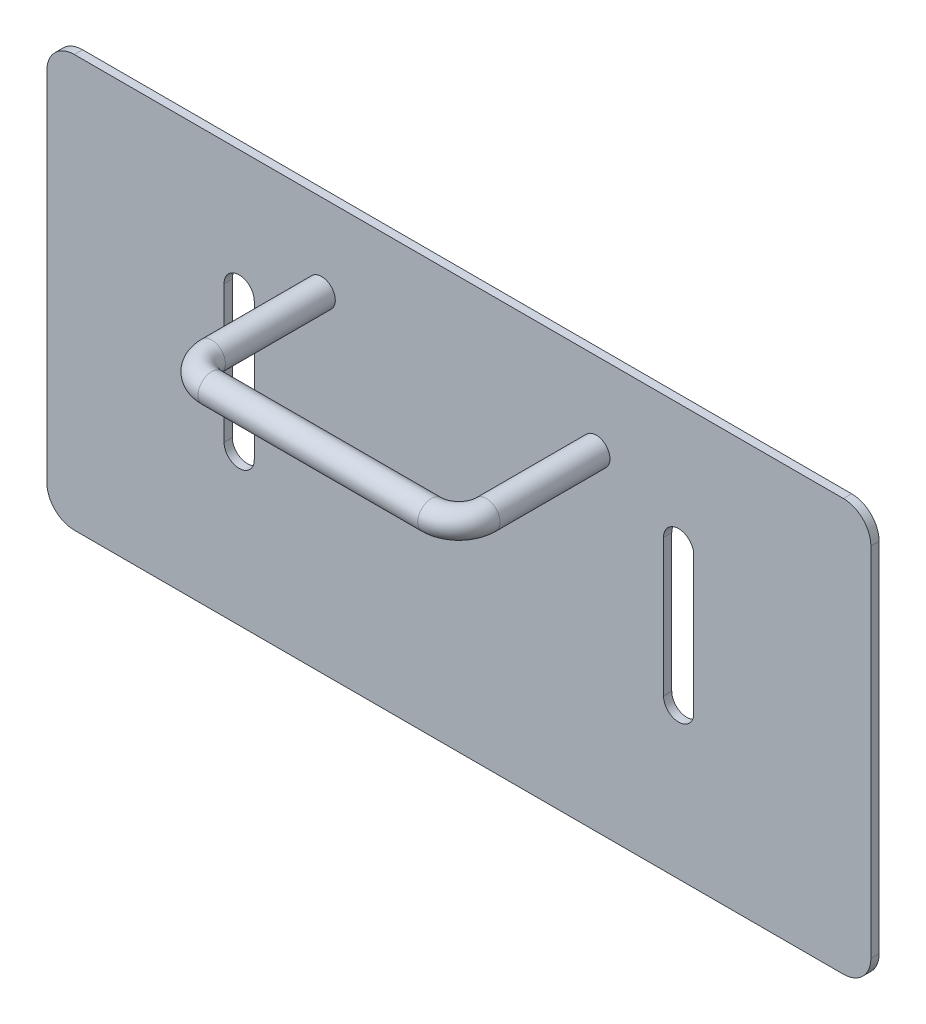
ISO-10303-21;
HEADER;
FILE_DESCRIPTION(('STEP AP214'),'2;1');
FILE_NAME('part.step','',(''),(''),'','','');
FILE_SCHEMA(('AUTOMOTIVE_DESIGN { 1 0 10303 214 1 1 1 1 }'));
ENDSEC;
DATA;
#1=APPLICATION_CONTEXT('core data for automotive mechanical design processes');
#2=APPLICATION_PROTOCOL_DEFINITION('international standard','automotive_design',2000,#1);
#3=PRODUCT_CONTEXT('',#1,'mechanical');
#4=PRODUCT('Part','Part','',(#3));
#5=PRODUCT_RELATED_PRODUCT_CATEGORY('part','',(#4));
#6=PRODUCT_DEFINITION_FORMATION('','',#4);
#7=PRODUCT_DEFINITION_CONTEXT('part definition',#1,'design');
#8=PRODUCT_DEFINITION('design','',#6,#7);
#9=PRODUCT_DEFINITION_SHAPE('','',#8);
#10=(LENGTH_UNIT() NAMED_UNIT(*) SI_UNIT(.MILLI.,.METRE.));
#11=(NAMED_UNIT(*) PLANE_ANGLE_UNIT() SI_UNIT($,.RADIAN.));
#12=(NAMED_UNIT(*) SI_UNIT($,.STERADIAN.) SOLID_ANGLE_UNIT());
#13=UNCERTAINTY_MEASURE_WITH_UNIT(LENGTH_MEASURE(1.E-05),#10,'distance_accuracy_value','');
#14=(GEOMETRIC_REPRESENTATION_CONTEXT(3) GLOBAL_UNCERTAINTY_ASSIGNED_CONTEXT((#13)) GLOBAL_UNIT_ASSIGNED_CONTEXT((#10,
#11,#12)) REPRESENTATION_CONTEXT('',''));
#15=CARTESIAN_POINT('',(0.,0.,0.));
#16=DIRECTION('',(0.,0.,1.));
#17=DIRECTION('',(1.,0.,0.));
#18=AXIS2_PLACEMENT_3D('',#15,#16,#17);
#19=CARTESIAN_POINT('',(0.,0.,0.));
#20=DIRECTION('',(0.,0.,1.));
#21=DIRECTION('',(1.,0.,0.));
#22=AXIS2_PLACEMENT_3D('',#19,#20,#21);
#23=PLANE('',#22);
#24=DIRECTION('',(1.,0.,0.));
#25=VECTOR('',#24,1.);
#26=CARTESIAN_POINT('',(-150.,-75.,0.));
#27=LINE('',#26,#25);
#28=CARTESIAN_POINT('',(-140.,-75.,0.));
#29=VERTEX_POINT('',#28);
#30=CARTESIAN_POINT('',(140.,-75.,0.));
#31=VERTEX_POINT('',#30);
#32=EDGE_CURVE('E244',#29,#31,#27,.T.);
#33=ORIENTED_EDGE('',*,*,#32,.T.);
#34=CARTESIAN_POINT('',(140.,-65.,0.));
#35=DIRECTION('',(0.,0.,1.));
#36=DIRECTION('',(1.,0.,0.));
#37=AXIS2_PLACEMENT_3D('',#34,#35,#36);
#38=CIRCLE('',#37,10.);
#39=CARTESIAN_POINT('',(150.,-65.,0.));
#40=VERTEX_POINT('',#39);
#41=EDGE_CURVE('E274',#31,#40,#38,.T.);
#42=ORIENTED_EDGE('',*,*,#41,.T.);
#43=DIRECTION('',(0.,1.,0.));
#44=VECTOR('',#43,1.);
#45=CARTESIAN_POINT('',(150.,75.,0.));
#46=LINE('',#45,#44);
#47=CARTESIAN_POINT('',(150.,65.,0.));
#48=VERTEX_POINT('',#47);
#49=EDGE_CURVE('E239',#40,#48,#46,.T.);
#50=ORIENTED_EDGE('',*,*,#49,.T.);
#51=CARTESIAN_POINT('',(140.,65.,0.));
#52=DIRECTION('',(0.,0.,1.));
#53=DIRECTION('',(1.,0.,0.));
#54=AXIS2_PLACEMENT_3D('',#51,#52,#53);
#55=CIRCLE('',#54,10.);
#56=CARTESIAN_POINT('',(140.,75.,0.));
#57=VERTEX_POINT('',#56);
#58=EDGE_CURVE('E268',#48,#57,#55,.T.);
#59=ORIENTED_EDGE('',*,*,#58,.T.);
#60=DIRECTION('',(-1.,0.,0.));
#61=VECTOR('',#60,1.);
#62=CARTESIAN_POINT('',(-150.,75.,0.));
#63=LINE('',#62,#61);
#64=CARTESIAN_POINT('',(-140.,75.,0.));
#65=VERTEX_POINT('',#64);
#66=EDGE_CURVE('E256',#57,#65,#63,.T.);
#67=ORIENTED_EDGE('',*,*,#66,.T.);
#68=CARTESIAN_POINT('',(-140.,65.,0.));
#69=DIRECTION('',(0.,0.,1.));
#70=DIRECTION('',(1.,0.,0.));
#71=AXIS2_PLACEMENT_3D('',#68,#69,#70);
#72=CIRCLE('',#71,10.);
#73=CARTESIAN_POINT('',(-150.,65.,0.));
#74=VERTEX_POINT('',#73);
#75=EDGE_CURVE('E270',#65,#74,#72,.T.);
#76=ORIENTED_EDGE('',*,*,#75,.T.);
#77=DIRECTION('',(0.,-1.,0.));
#78=VECTOR('',#77,1.);
#79=CARTESIAN_POINT('',(-150.,75.,0.));
#80=LINE('',#79,#78);
#81=CARTESIAN_POINT('',(-150.,-65.,0.));
#82=VERTEX_POINT('',#81);
#83=EDGE_CURVE('E259',#74,#82,#80,.T.);
#84=ORIENTED_EDGE('',*,*,#83,.T.);
#85=CARTESIAN_POINT('',(-140.,-65.,0.));
#86=DIRECTION('',(0.,0.,1.));
#87=DIRECTION('',(1.,0.,0.));
#88=AXIS2_PLACEMENT_3D('',#85,#86,#87);
#89=CIRCLE('',#88,10.);
#90=EDGE_CURVE('E272',#82,#29,#89,.T.);
#91=ORIENTED_EDGE('',*,*,#90,.T.);
#92=EDGE_LOOP('',(#33,#42,#50,#59,#67,#76,#84,#91));
#93=FACE_BOUND('',#92,.T.);
#94=CARTESIAN_POINT('',(80.,-20.,0.));
#95=DIRECTION('',(0.,0.,1.));
#96=DIRECTION('',(1.,0.,0.));
#97=AXIS2_PLACEMENT_3D('',#94,#95,#96);
#98=CIRCLE('',#97,5.49999999999999);
#99=CARTESIAN_POINT('',(74.5,-20.,0.));
#100=VERTEX_POINT('',#99);
#101=CARTESIAN_POINT('',(85.5,-20.,0.));
#102=VERTEX_POINT('',#101);
#103=EDGE_CURVE('E200',#100,#102,#98,.T.);
#104=ORIENTED_EDGE('',*,*,#103,.F.);
#105=DIRECTION('',(0.,-1.,0.));
#106=VECTOR('',#105,1.);
#107=CARTESIAN_POINT('',(74.5,-20.,0.));
#108=LINE('',#107,#106);
#109=CARTESIAN_POINT('',(74.5,30.,0.));
#110=VERTEX_POINT('',#109);
#111=EDGE_CURVE('E208',#110,#100,#108,.T.);
#112=ORIENTED_EDGE('',*,*,#111,.F.);
#113=CARTESIAN_POINT('',(80.,30.,0.));
#114=DIRECTION('',(0.,0.,1.));
#115=DIRECTION('',(1.,0.,0.));
#116=AXIS2_PLACEMENT_3D('',#113,#114,#115);
#117=CIRCLE('',#116,5.49999999999999);
#118=CARTESIAN_POINT('',(85.5,30.,0.));
#119=VERTEX_POINT('',#118);
#120=EDGE_CURVE('E205',#119,#110,#117,.T.);
#121=ORIENTED_EDGE('',*,*,#120,.F.);
#122=DIRECTION('',(0.,1.,0.));
#123=VECTOR('',#122,1.);
#124=CARTESIAN_POINT('',(85.5,-20.,0.));
#125=LINE('',#124,#123);
#126=EDGE_CURVE('E202',#102,#119,#125,.T.);
#127=ORIENTED_EDGE('',*,*,#126,.F.);
#128=EDGE_LOOP('',(#104,#112,#121,#127));
#129=FACE_BOUND('',#128,.T.);
#130=CARTESIAN_POINT('',(-80.,-20.,0.));
#131=DIRECTION('',(0.,0.,1.));
#132=DIRECTION('',(1.,0.,0.));
#133=AXIS2_PLACEMENT_3D('',#130,#131,#132);
#134=CIRCLE('',#133,5.49999999999999);
#135=CARTESIAN_POINT('',(-85.5,-20.,0.));
#136=VERTEX_POINT('',#135);
#137=CARTESIAN_POINT('',(-74.5,-20.,0.));
#138=VERTEX_POINT('',#137);
#139=EDGE_CURVE('E186',#136,#138,#134,.T.);
#140=ORIENTED_EDGE('',*,*,#139,.F.);
#141=DIRECTION('',(0.,-1.,0.));
#142=VECTOR('',#141,1.);
#143=CARTESIAN_POINT('',(-85.5,-20.,0.));
#144=LINE('',#143,#142);
#145=CARTESIAN_POINT('',(-85.5,30.,0.));
#146=VERTEX_POINT('',#145);
#147=EDGE_CURVE('E190',#146,#136,#144,.T.);
#148=ORIENTED_EDGE('',*,*,#147,.F.);
#149=CARTESIAN_POINT('',(-80.,30.,0.));
#150=DIRECTION('',(0.,0.,1.));
#151=DIRECTION('',(1.,0.,0.));
#152=AXIS2_PLACEMENT_3D('',#149,#150,#151);
#153=CIRCLE('',#152,5.49999999999999);
#154=CARTESIAN_POINT('',(-74.5,30.,0.));
#155=VERTEX_POINT('',#154);
#156=EDGE_CURVE('E171',#155,#146,#153,.T.);
#157=ORIENTED_EDGE('',*,*,#156,.F.);
#158=DIRECTION('',(0.,1.,0.));
#159=VECTOR('',#158,1.);
#160=CARTESIAN_POINT('',(-74.5,-20.,0.));
#161=LINE('',#160,#159);
#162=EDGE_CURVE('E181',#138,#155,#161,.T.);
#163=ORIENTED_EDGE('',*,*,#162,.F.);
#164=EDGE_LOOP('',(#140,#148,#157,#163));
#165=FACE_BOUND('',#164,.T.);
#166=CARTESIAN_POINT('',(50.,45.,0.));
#167=DIRECTION('',(0.,0.,1.));
#168=DIRECTION('',(1.,0.,0.));
#169=AXIS2_PLACEMENT_3D('',#166,#167,#168);
#170=CIRCLE('',#169,5.);
#171=CARTESIAN_POINT('',(55.,45.,0.));
#172=VERTEX_POINT('',#171);
#173=EDGE_CURVE('E12',#172,#172,#170,.T.);
#174=ORIENTED_EDGE('',*,*,#173,.F.);
#175=EDGE_LOOP('',(#174));
#176=FACE_BOUND('',#175,.T.);
#177=CARTESIAN_POINT('',(-50.,45.,0.));
#178=DIRECTION('',(0.,0.,-1.));
#179=DIRECTION('',(-1.,0.,0.));
#180=AXIS2_PLACEMENT_3D('',#177,#178,#179);
#181=CIRCLE('',#180,5.);
#182=CARTESIAN_POINT('',(-55.,45.,0.));
#183=VERTEX_POINT('',#182);
#184=EDGE_CURVE('E430',#183,#183,#181,.T.);
#185=ORIENTED_EDGE('',*,*,#184,.T.);
#186=EDGE_LOOP('',(#185));
#187=FACE_BOUND('',#186,.T.);
#188=ADVANCED_FACE('F55',(#93,#129,#165,#176,#187),#23,.T.);
#189=CARTESIAN_POINT('',(150.,75.,-3.));
#190=DIRECTION('',(1.,0.,0.));
#191=DIRECTION('',(0.,1.,0.));
#192=AXIS2_PLACEMENT_3D('',#189,#190,#191);
#193=PLANE('',#192);
#194=ORIENTED_EDGE('',*,*,#49,.F.);
#195=DIRECTION('',(0.,0.,1.));
#196=VECTOR('',#195,1.);
#197=CARTESIAN_POINT('',(150.,-65.,-3.));
#198=LINE('',#197,#196);
#199=CARTESIAN_POINT('',(150.,-65.,-3.));
#200=VERTEX_POINT('',#199);
#201=EDGE_CURVE('E279',#40,#200,#198,.F.);
#202=ORIENTED_EDGE('',*,*,#201,.T.);
#203=DIRECTION('',(0.,1.,0.));
#204=VECTOR('',#203,1.);
#205=CARTESIAN_POINT('',(150.,75.,-3.));
#206=LINE('',#205,#204);
#207=CARTESIAN_POINT('',(150.,65.,-3.));
#208=VERTEX_POINT('',#207);
#209=EDGE_CURVE('E240',#200,#208,#206,.T.);
#210=ORIENTED_EDGE('',*,*,#209,.T.);
#211=DIRECTION('',(0.,0.,1.));
#212=VECTOR('',#211,1.);
#213=CARTESIAN_POINT('',(150.,65.,-3.));
#214=LINE('',#213,#212);
#215=EDGE_CURVE('E276',#208,#48,#214,.T.);
#216=ORIENTED_EDGE('',*,*,#215,.T.);
#217=EDGE_LOOP('',(#194,#202,#210,#216));
#218=FACE_BOUND('',#217,.T.);
#219=ADVANCED_FACE('F311',(#218),#193,.T.);
#220=CARTESIAN_POINT('',(-150.,-75.,-3.));
#221=DIRECTION('',(0.,-1.,0.));
#222=DIRECTION('',(0.,0.,-1.));
#223=AXIS2_PLACEMENT_3D('',#220,#221,#222);
#224=PLANE('',#223);
#225=DIRECTION('',(1.,0.,0.));
#226=VECTOR('',#225,1.);
#227=CARTESIAN_POINT('',(-150.,-75.,-3.));
#228=LINE('',#227,#226);
#229=CARTESIAN_POINT('',(-140.,-75.,-3.));
#230=VERTEX_POINT('',#229);
#231=CARTESIAN_POINT('',(140.,-75.,-3.));
#232=VERTEX_POINT('',#231);
#233=EDGE_CURVE('E250',#230,#232,#228,.T.);
#234=ORIENTED_EDGE('',*,*,#233,.T.);
#235=DIRECTION('',(0.,0.,1.));
#236=VECTOR('',#235,1.);
#237=CARTESIAN_POINT('',(140.,-75.,-3.));
#238=LINE('',#237,#236);
#239=EDGE_CURVE('E265',#232,#31,#238,.T.);
#240=ORIENTED_EDGE('',*,*,#239,.T.);
#241=ORIENTED_EDGE('',*,*,#32,.F.);
#242=DIRECTION('',(0.,0.,1.));
#243=VECTOR('',#242,1.);
#244=CARTESIAN_POINT('',(-140.,-75.,-3.));
#245=LINE('',#244,#243);
#246=EDGE_CURVE('E253',#29,#230,#245,.F.);
#247=ORIENTED_EDGE('',*,*,#246,.T.);
#248=EDGE_LOOP('',(#234,#240,#241,#247));
#249=FACE_BOUND('',#248,.T.);
#250=ADVANCED_FACE('F323',(#249),#224,.T.);
#251=CARTESIAN_POINT('',(-150.,75.,-3.));
#252=DIRECTION('',(-1.,0.,0.));
#253=DIRECTION('',(0.,-1.,0.));
#254=AXIS2_PLACEMENT_3D('',#251,#252,#253);
#255=PLANE('',#254);
#256=DIRECTION('',(0.,-1.,0.));
#257=VECTOR('',#256,1.);
#258=CARTESIAN_POINT('',(-150.,75.,-3.));
#259=LINE('',#258,#257);
#260=CARTESIAN_POINT('',(-150.,65.,-3.));
#261=VERTEX_POINT('',#260);
#262=CARTESIAN_POINT('',(-150.,-65.,-3.));
#263=VERTEX_POINT('',#262);
#264=EDGE_CURVE('E247',#261,#263,#259,.T.);
#265=ORIENTED_EDGE('',*,*,#264,.T.);
#266=DIRECTION('',(0.,0.,1.));
#267=VECTOR('',#266,1.);
#268=CARTESIAN_POINT('',(-150.,-65.,-3.));
#269=LINE('',#268,#267);
#270=EDGE_CURVE('E291',#263,#82,#269,.T.);
#271=ORIENTED_EDGE('',*,*,#270,.T.);
#272=ORIENTED_EDGE('',*,*,#83,.F.);
#273=DIRECTION('',(0.,0.,1.));
#274=VECTOR('',#273,1.);
#275=CARTESIAN_POINT('',(-150.,65.,-3.));
#276=LINE('',#275,#274);
#277=EDGE_CURVE('E289',#74,#261,#276,.F.);
#278=ORIENTED_EDGE('',*,*,#277,.T.);
#279=EDGE_LOOP('',(#265,#271,#272,#278));
#280=FACE_BOUND('',#279,.T.);
#281=ADVANCED_FACE('F330',(#280),#255,.T.);
#282=CARTESIAN_POINT('',(-150.,75.,-3.));
#283=DIRECTION('',(0.,1.,0.));
#284=DIRECTION('',(0.,0.,1.));
#285=AXIS2_PLACEMENT_3D('',#282,#283,#284);
#286=PLANE('',#285);
#287=DIRECTION('',(-1.,0.,0.));
#288=VECTOR('',#287,1.);
#289=CARTESIAN_POINT('',(-150.,75.,-3.));
#290=LINE('',#289,#288);
#291=CARTESIAN_POINT('',(140.,75.,-3.));
#292=VERTEX_POINT('',#291);
#293=CARTESIAN_POINT('',(-140.,75.,-3.));
#294=VERTEX_POINT('',#293);
#295=EDGE_CURVE('E243',#292,#294,#290,.T.);
#296=ORIENTED_EDGE('',*,*,#295,.T.);
#297=DIRECTION('',(0.,0.,1.));
#298=VECTOR('',#297,1.);
#299=CARTESIAN_POINT('',(-140.,75.,-3.));
#300=LINE('',#299,#298);
#301=EDGE_CURVE('E59',#294,#65,#300,.T.);
#302=ORIENTED_EDGE('',*,*,#301,.T.);
#303=ORIENTED_EDGE('',*,*,#66,.F.);
#304=DIRECTION('',(0.,0.,1.));
#305=VECTOR('',#304,1.);
#306=CARTESIAN_POINT('',(140.,75.,-3.));
#307=LINE('',#306,#305);
#308=EDGE_CURVE('E293',#57,#292,#307,.F.);
#309=ORIENTED_EDGE('',*,*,#308,.T.);
#310=EDGE_LOOP('',(#296,#302,#303,#309));
#311=FACE_BOUND('',#310,.T.);
#312=ADVANCED_FACE('F300',(#311),#286,.T.);
#313=CARTESIAN_POINT('',(0.,0.,-3.));
#314=DIRECTION('',(0.,0.,1.));
#315=DIRECTION('',(1.,0.,0.));
#316=AXIS2_PLACEMENT_3D('',#313,#314,#315);
#317=PLANE('',#316);
#318=DIRECTION('',(0.,-1.,0.));
#319=VECTOR('',#318,1.);
#320=CARTESIAN_POINT('',(-85.5,0.,-3.));
#321=LINE('',#320,#319);
#322=CARTESIAN_POINT('',(-85.5,30.,-3.));
#323=VERTEX_POINT('',#322);
#324=CARTESIAN_POINT('',(-85.5,-20.,-3.));
#325=VERTEX_POINT('',#324);
#326=EDGE_CURVE('E233',#323,#325,#321,.T.);
#327=ORIENTED_EDGE('',*,*,#326,.T.);
#328=CARTESIAN_POINT('',(-80.,-20.,-3.));
#329=DIRECTION('',(0.,0.,1.));
#330=DIRECTION('',(1.,0.,0.));
#331=AXIS2_PLACEMENT_3D('',#328,#329,#330);
#332=CIRCLE('',#331,5.49999999999999);
#333=CARTESIAN_POINT('',(-74.5,-20.,-3.));
#334=VERTEX_POINT('',#333);
#335=EDGE_CURVE('E236',#325,#334,#332,.T.);
#336=ORIENTED_EDGE('',*,*,#335,.T.);
#337=DIRECTION('',(0.,1.,0.));
#338=VECTOR('',#337,1.);
#339=CARTESIAN_POINT('',(-74.5,0.,-3.));
#340=LINE('',#339,#338);
#341=CARTESIAN_POINT('',(-74.5,30.,-3.));
#342=VERTEX_POINT('',#341);
#343=EDGE_CURVE('E230',#334,#342,#340,.T.);
#344=ORIENTED_EDGE('',*,*,#343,.T.);
#345=CARTESIAN_POINT('',(-80.,30.,-3.));
#346=DIRECTION('',(0.,0.,1.));
#347=DIRECTION('',(1.,0.,0.));
#348=AXIS2_PLACEMENT_3D('',#345,#346,#347);
#349=CIRCLE('',#348,5.49999999999999);
#350=EDGE_CURVE('E174',#342,#323,#349,.T.);
#351=ORIENTED_EDGE('',*,*,#350,.T.);
#352=EDGE_LOOP('',(#327,#336,#344,#351));
#353=FACE_BOUND('',#352,.T.);
#354=DIRECTION('',(0.,-1.,0.));
#355=VECTOR('',#354,1.);
#356=CARTESIAN_POINT('',(74.5,0.,-3.));
#357=LINE('',#356,#355);
#358=CARTESIAN_POINT('',(74.5,30.,-3.));
#359=VERTEX_POINT('',#358);
#360=CARTESIAN_POINT('',(74.5,-20.,-3.));
#361=VERTEX_POINT('',#360);
#362=EDGE_CURVE('E224',#359,#361,#357,.T.);
#363=ORIENTED_EDGE('',*,*,#362,.T.);
#364=CARTESIAN_POINT('',(80.,-20.,-3.));
#365=DIRECTION('',(0.,0.,1.));
#366=DIRECTION('',(1.,0.,0.));
#367=AXIS2_PLACEMENT_3D('',#364,#365,#366);
#368=CIRCLE('',#367,5.49999999999999);
#369=CARTESIAN_POINT('',(85.5,-20.,-3.));
#370=VERTEX_POINT('',#369);
#371=EDGE_CURVE('E227',#361,#370,#368,.T.);
#372=ORIENTED_EDGE('',*,*,#371,.T.);
#373=DIRECTION('',(0.,1.,0.));
#374=VECTOR('',#373,1.);
#375=CARTESIAN_POINT('',(85.5,0.,-3.));
#376=LINE('',#375,#374);
#377=CARTESIAN_POINT('',(85.5,30.,-3.));
#378=VERTEX_POINT('',#377);
#379=EDGE_CURVE('E197',#370,#378,#376,.T.);
#380=ORIENTED_EDGE('',*,*,#379,.T.);
#381=CARTESIAN_POINT('',(80.,30.,-3.));
#382=DIRECTION('',(0.,0.,1.));
#383=DIRECTION('',(1.,0.,0.));
#384=AXIS2_PLACEMENT_3D('',#381,#382,#383);
#385=CIRCLE('',#384,5.49999999999999);
#386=EDGE_CURVE('E221',#378,#359,#385,.T.);
#387=ORIENTED_EDGE('',*,*,#386,.T.);
#388=EDGE_LOOP('',(#363,#372,#380,#387));
#389=FACE_BOUND('',#388,.T.);
#390=ORIENTED_EDGE('',*,*,#209,.F.);
#391=CARTESIAN_POINT('',(140.,-65.,-3.));
#392=DIRECTION('',(0.,0.,1.));
#393=DIRECTION('',(1.,0.,0.));
#394=AXIS2_PLACEMENT_3D('',#391,#392,#393);
#395=CIRCLE('',#394,10.);
#396=EDGE_CURVE('E287',#200,#232,#395,.F.);
#397=ORIENTED_EDGE('',*,*,#396,.T.);
#398=ORIENTED_EDGE('',*,*,#233,.F.);
#399=CARTESIAN_POINT('',(-140.,-65.,-3.));
#400=DIRECTION('',(0.,0.,1.));
#401=DIRECTION('',(1.,0.,0.));
#402=AXIS2_PLACEMENT_3D('',#399,#400,#401);
#403=CIRCLE('',#402,10.);
#404=EDGE_CURVE('E285',#230,#263,#403,.F.);
#405=ORIENTED_EDGE('',*,*,#404,.T.);
#406=ORIENTED_EDGE('',*,*,#264,.F.);
#407=CARTESIAN_POINT('',(-140.,65.,-3.));
#408=DIRECTION('',(0.,0.,1.));
#409=DIRECTION('',(1.,0.,0.));
#410=AXIS2_PLACEMENT_3D('',#407,#408,#409);
#411=CIRCLE('',#410,10.);
#412=EDGE_CURVE('E283',#261,#294,#411,.F.);
#413=ORIENTED_EDGE('',*,*,#412,.T.);
#414=ORIENTED_EDGE('',*,*,#295,.F.);
#415=CARTESIAN_POINT('',(140.,65.,-3.));
#416=DIRECTION('',(0.,0.,1.));
#417=DIRECTION('',(1.,0.,0.));
#418=AXIS2_PLACEMENT_3D('',#415,#416,#417);
#419=CIRCLE('',#418,10.);
#420=EDGE_CURVE('E281',#292,#208,#419,.F.);
#421=ORIENTED_EDGE('',*,*,#420,.T.);
#422=EDGE_LOOP('',(#390,#397,#398,#405,#406,#413,#414,#421));
#423=FACE_BOUND('',#422,.T.);
#424=ADVANCED_FACE('F316',(#353,#389,#423),#317,.F.);
#425=CARTESIAN_POINT('',(140.,-65.,-3.));
#426=DIRECTION('',(0.,0.,1.));
#427=DIRECTION('',(1.,0.,0.));
#428=AXIS2_PLACEMENT_3D('',#425,#426,#427);
#429=CYLINDRICAL_SURFACE('',#428,10.);
#430=ORIENTED_EDGE('',*,*,#396,.F.);
#431=ORIENTED_EDGE('',*,*,#201,.F.);
#432=ORIENTED_EDGE('',*,*,#41,.F.);
#433=ORIENTED_EDGE('',*,*,#239,.F.);
#434=EDGE_LOOP('',(#430,#431,#432,#433));
#435=FACE_BOUND('',#434,.T.);
#436=ADVANCED_FACE('F320',(#435),#429,.T.);
#437=CARTESIAN_POINT('',(-140.,-65.,-3.));
#438=DIRECTION('',(0.,0.,1.));
#439=DIRECTION('',(1.,0.,0.));
#440=AXIS2_PLACEMENT_3D('',#437,#438,#439);
#441=CYLINDRICAL_SURFACE('',#440,10.);
#442=ORIENTED_EDGE('',*,*,#404,.F.);
#443=ORIENTED_EDGE('',*,*,#246,.F.);
#444=ORIENTED_EDGE('',*,*,#90,.F.);
#445=ORIENTED_EDGE('',*,*,#270,.F.);
#446=EDGE_LOOP('',(#442,#443,#444,#445));
#447=FACE_BOUND('',#446,.T.);
#448=ADVANCED_FACE('F328',(#447),#441,.T.);
#449=CARTESIAN_POINT('',(-140.,65.,-3.));
#450=DIRECTION('',(0.,0.,1.));
#451=DIRECTION('',(1.,0.,0.));
#452=AXIS2_PLACEMENT_3D('',#449,#450,#451);
#453=CYLINDRICAL_SURFACE('',#452,10.);
#454=ORIENTED_EDGE('',*,*,#412,.F.);
#455=ORIENTED_EDGE('',*,*,#277,.F.);
#456=ORIENTED_EDGE('',*,*,#75,.F.);
#457=ORIENTED_EDGE('',*,*,#301,.F.);
#458=EDGE_LOOP('',(#454,#455,#456,#457));
#459=FACE_BOUND('',#458,.T.);
#460=ADVANCED_FACE('F333',(#459),#453,.T.);
#461=CARTESIAN_POINT('',(140.,65.,-3.));
#462=DIRECTION('',(0.,0.,1.));
#463=DIRECTION('',(1.,0.,0.));
#464=AXIS2_PLACEMENT_3D('',#461,#462,#463);
#465=CYLINDRICAL_SURFACE('',#464,10.);
#466=ORIENTED_EDGE('',*,*,#420,.F.);
#467=ORIENTED_EDGE('',*,*,#308,.F.);
#468=ORIENTED_EDGE('',*,*,#58,.F.);
#469=ORIENTED_EDGE('',*,*,#215,.F.);
#470=EDGE_LOOP('',(#466,#467,#468,#469));
#471=FACE_BOUND('',#470,.T.);
#472=ADVANCED_FACE('F57',(#471),#465,.T.);
#473=CARTESIAN_POINT('',(80.,-20.,-10.));
#474=DIRECTION('',(0.,0.,1.));
#475=DIRECTION('',(1.,0.,0.));
#476=AXIS2_PLACEMENT_3D('',#473,#474,#475);
#477=CYLINDRICAL_SURFACE('',#476,5.49999999999999);
#478=DIRECTION('',(0.,0.,1.));
#479=VECTOR('',#478,1.);
#480=CARTESIAN_POINT('',(74.5,-20.,-10.));
#481=LINE('',#480,#479);
#482=EDGE_CURVE('E212',#361,#100,#481,.T.);
#483=ORIENTED_EDGE('',*,*,#482,.T.);
#484=ORIENTED_EDGE('',*,*,#103,.T.);
#485=DIRECTION('',(0.,0.,1.));
#486=VECTOR('',#485,1.);
#487=CARTESIAN_POINT('',(85.5,-20.,-10.));
#488=LINE('',#487,#486);
#489=EDGE_CURVE('E211',#370,#102,#488,.T.);
#490=ORIENTED_EDGE('',*,*,#489,.F.);
#491=ORIENTED_EDGE('',*,*,#371,.F.);
#492=EDGE_LOOP('',(#483,#484,#490,#491));
#493=FACE_BOUND('',#492,.T.);
#494=ADVANCED_FACE('F339',(#493),#477,.F.);
#495=CARTESIAN_POINT('',(74.5,-20.,-10.));
#496=DIRECTION('',(-1.,0.,0.));
#497=DIRECTION('',(0.,0.,1.));
#498=AXIS2_PLACEMENT_3D('',#495,#496,#497);
#499=PLANE('',#498);
#500=DIRECTION('',(0.,0.,1.));
#501=VECTOR('',#500,1.);
#502=CARTESIAN_POINT('',(74.5,30.,-10.));
#503=LINE('',#502,#501);
#504=EDGE_CURVE('E214',#359,#110,#503,.T.);
#505=ORIENTED_EDGE('',*,*,#504,.T.);
#506=ORIENTED_EDGE('',*,*,#111,.T.);
#507=ORIENTED_EDGE('',*,*,#482,.F.);
#508=ORIENTED_EDGE('',*,*,#362,.F.);
#509=EDGE_LOOP('',(#505,#506,#507,#508));
#510=FACE_BOUND('',#509,.T.);
#511=ADVANCED_FACE('F367',(#510),#499,.F.);
#512=CARTESIAN_POINT('',(80.,30.,-10.));
#513=DIRECTION('',(0.,0.,1.));
#514=DIRECTION('',(1.,0.,0.));
#515=AXIS2_PLACEMENT_3D('',#512,#513,#514);
#516=CYLINDRICAL_SURFACE('',#515,5.49999999999999);
#517=DIRECTION('',(0.,0.,1.));
#518=VECTOR('',#517,1.);
#519=CARTESIAN_POINT('',(85.5,30.,-10.));
#520=LINE('',#519,#518);
#521=EDGE_CURVE('E79',#378,#119,#520,.T.);
#522=ORIENTED_EDGE('',*,*,#521,.T.);
#523=ORIENTED_EDGE('',*,*,#120,.T.);
#524=ORIENTED_EDGE('',*,*,#504,.F.);
#525=ORIENTED_EDGE('',*,*,#386,.F.);
#526=EDGE_LOOP('',(#522,#523,#524,#525));
#527=FACE_BOUND('',#526,.T.);
#528=ADVANCED_FACE('F369',(#527),#516,.F.);
#529=CARTESIAN_POINT('',(85.5,-20.,-10.));
#530=DIRECTION('',(1.,0.,0.));
#531=DIRECTION('',(0.,0.,-1.));
#532=AXIS2_PLACEMENT_3D('',#529,#530,#531);
#533=PLANE('',#532);
#534=ORIENTED_EDGE('',*,*,#489,.T.);
#535=ORIENTED_EDGE('',*,*,#126,.T.);
#536=ORIENTED_EDGE('',*,*,#521,.F.);
#537=ORIENTED_EDGE('',*,*,#379,.F.);
#538=EDGE_LOOP('',(#534,#535,#536,#537));
#539=FACE_BOUND('',#538,.T.);
#540=ADVANCED_FACE('F376',(#539),#533,.F.);
#541=CARTESIAN_POINT('',(-80.,-20.,-10.));
#542=DIRECTION('',(0.,0.,1.));
#543=DIRECTION('',(1.,0.,0.));
#544=AXIS2_PLACEMENT_3D('',#541,#542,#543);
#545=CYLINDRICAL_SURFACE('',#544,5.49999999999999);
#546=DIRECTION('',(0.,0.,1.));
#547=VECTOR('',#546,1.);
#548=CARTESIAN_POINT('',(-85.5,-20.,-10.));
#549=LINE('',#548,#547);
#550=EDGE_CURVE('E195',#325,#136,#549,.T.);
#551=ORIENTED_EDGE('',*,*,#550,.T.);
#552=ORIENTED_EDGE('',*,*,#139,.T.);
#553=DIRECTION('',(0.,0.,1.));
#554=VECTOR('',#553,1.);
#555=CARTESIAN_POINT('',(-74.5,-20.,-10.));
#556=LINE('',#555,#554);
#557=EDGE_CURVE('E177',#334,#138,#556,.T.);
#558=ORIENTED_EDGE('',*,*,#557,.F.);
#559=ORIENTED_EDGE('',*,*,#335,.F.);
#560=EDGE_LOOP('',(#551,#552,#558,#559));
#561=FACE_BOUND('',#560,.T.);
#562=ADVANCED_FACE('F378',(#561),#545,.F.);
#563=CARTESIAN_POINT('',(-85.5,-20.,-10.));
#564=DIRECTION('',(-1.,0.,0.));
#565=DIRECTION('',(0.,0.,1.));
#566=AXIS2_PLACEMENT_3D('',#563,#564,#565);
#567=PLANE('',#566);
#568=DIRECTION('',(0.,0.,1.));
#569=VECTOR('',#568,1.);
#570=CARTESIAN_POINT('',(-85.5,30.,-10.));
#571=LINE('',#570,#569);
#572=EDGE_CURVE('E176',#323,#146,#571,.T.);
#573=ORIENTED_EDGE('',*,*,#572,.T.);
#574=ORIENTED_EDGE('',*,*,#147,.T.);
#575=ORIENTED_EDGE('',*,*,#550,.F.);
#576=ORIENTED_EDGE('',*,*,#326,.F.);
#577=EDGE_LOOP('',(#573,#574,#575,#576));
#578=FACE_BOUND('',#577,.T.);
#579=ADVANCED_FACE('F384',(#578),#567,.F.);
#580=CARTESIAN_POINT('',(-80.,30.,-10.));
#581=DIRECTION('',(0.,0.,1.));
#582=DIRECTION('',(1.,0.,0.));
#583=AXIS2_PLACEMENT_3D('',#580,#581,#582);
#584=CYLINDRICAL_SURFACE('',#583,5.49999999999999);
#585=DIRECTION('',(0.,0.,1.));
#586=VECTOR('',#585,1.);
#587=CARTESIAN_POINT('',(-74.5,30.,-10.));
#588=LINE('',#587,#586);
#589=EDGE_CURVE('E71',#342,#155,#588,.T.);
#590=ORIENTED_EDGE('',*,*,#589,.T.);
#591=ORIENTED_EDGE('',*,*,#156,.T.);
#592=ORIENTED_EDGE('',*,*,#572,.F.);
#593=ORIENTED_EDGE('',*,*,#350,.F.);
#594=EDGE_LOOP('',(#590,#591,#592,#593));
#595=FACE_BOUND('',#594,.T.);
#596=ADVANCED_FACE('F168',(#595),#584,.F.);
#597=CARTESIAN_POINT('',(-74.5,-20.,-10.));
#598=DIRECTION('',(1.,0.,0.));
#599=DIRECTION('',(0.,0.,-1.));
#600=AXIS2_PLACEMENT_3D('',#597,#598,#599);
#601=PLANE('',#600);
#602=ORIENTED_EDGE('',*,*,#557,.T.);
#603=ORIENTED_EDGE('',*,*,#162,.T.);
#604=ORIENTED_EDGE('',*,*,#589,.F.);
#605=ORIENTED_EDGE('',*,*,#343,.F.);
#606=EDGE_LOOP('',(#602,#603,#604,#605));
#607=FACE_BOUND('',#606,.T.);
#608=ADVANCED_FACE('F182',(#607),#601,.F.);
#609=CARTESIAN_POINT('',(-50.,45.,0.));
#610=DIRECTION('',(0.,0.,1.));
#611=DIRECTION('',(1.,0.,0.));
#612=AXIS2_PLACEMENT_3D('',#609,#610,#611);
#613=CYLINDRICAL_SURFACE('',#612,5.);
#614=CARTESIAN_POINT('',(-50.,45.,40.));
#615=DIRECTION('',(0.,0.,-1.));
#616=DIRECTION('',(-1.,0.,0.));
#617=AXIS2_PLACEMENT_3D('',#614,#615,#616);
#618=CIRCLE('',#617,5.);
#619=CARTESIAN_POINT('',(-55.,45.,40.));
#620=VERTEX_POINT('',#619);
#621=EDGE_CURVE('E427',#620,#620,#618,.T.);
#622=ORIENTED_EDGE('',*,*,#621,.T.);
#623=EDGE_LOOP('',(#622));
#624=FACE_BOUND('',#623,.T.);
#625=ORIENTED_EDGE('',*,*,#184,.F.);
#626=EDGE_LOOP('',(#625));
#627=FACE_BOUND('',#626,.T.);
#628=ADVANCED_FACE('F398',(#624,#627),#613,.T.);
#629=CARTESIAN_POINT('',(-40.,45.,40.));
#630=DIRECTION('',(0.,1.,0.));
#631=DIRECTION('',(0.,0.,1.));
#632=AXIS2_PLACEMENT_3D('',#629,#630,#631);
#633=TOROIDAL_SURFACE('',#632,10.,5.);
#634=CARTESIAN_POINT('',(-40.,45.,50.));
#635=DIRECTION('',(-1.,0.,0.));
#636=DIRECTION('',(0.,0.,1.));
#637=AXIS2_PLACEMENT_3D('',#634,#635,#636);
#638=CIRCLE('',#637,5.);
#639=CARTESIAN_POINT('',(-40.,45.,55.));
#640=VERTEX_POINT('',#639);
#641=EDGE_CURVE('E433',#640,#640,#638,.T.);
#642=CARTESIAN_POINT('',(-40.,45.,40.));
#643=DIRECTION('',(0.,1.,0.));
#644=DIRECTION('',(0.,0.,1.));
#645=AXIS2_PLACEMENT_3D('',#642,#643,#644);
#646=CIRCLE('',#645,15.);
#647=EDGE_CURVE('',#620,#640,#646,.T.);
#648=ORIENTED_EDGE('',*,*,#621,.F.);
#649=ORIENTED_EDGE('',*,*,#641,.T.);
#650=ORIENTED_EDGE('',*,*,#647,.T.);
#651=ORIENTED_EDGE('',*,*,#647,.F.);
#652=EDGE_LOOP('',(#648,#650,#649,#651));
#653=FACE_BOUND('',#652,.T.);
#654=ADVANCED_FACE('F415',(#653),#633,.T.);
#655=CARTESIAN_POINT('',(-40.,45.,50.));
#656=DIRECTION('',(1.,0.,0.));
#657=DIRECTION('',(0.,0.,-1.));
#658=AXIS2_PLACEMENT_3D('',#655,#656,#657);
#659=CYLINDRICAL_SURFACE('',#658,5.);
#660=CARTESIAN_POINT('',(39.9999999999999,45.,50.));
#661=DIRECTION('',(-1.,0.,0.));
#662=DIRECTION('',(0.,0.,1.));
#663=AXIS2_PLACEMENT_3D('',#660,#661,#662);
#664=CIRCLE('',#663,5.);
#665=CARTESIAN_POINT('',(39.9999999999999,45.,55.));
#666=VERTEX_POINT('',#665);
#667=EDGE_CURVE('E438',#666,#666,#664,.T.);
#668=ORIENTED_EDGE('',*,*,#667,.T.);
#669=EDGE_LOOP('',(#668));
#670=FACE_BOUND('',#669,.T.);
#671=ORIENTED_EDGE('',*,*,#641,.F.);
#672=EDGE_LOOP('',(#671));
#673=FACE_BOUND('',#672,.T.);
#674=ADVANCED_FACE('F411',(#670,#673),#659,.T.);
#675=CARTESIAN_POINT('',(40.,45.,40.));
#676=DIRECTION('',(0.,1.,0.));
#677=DIRECTION('',(0.,0.,1.));
#678=AXIS2_PLACEMENT_3D('',#675,#676,#677);
#679=TOROIDAL_SURFACE('',#678,10.,5.);
#680=CARTESIAN_POINT('',(50.,45.,40.));
#681=DIRECTION('',(0.,0.,1.));
#682=DIRECTION('',(1.,0.,0.));
#683=AXIS2_PLACEMENT_3D('',#680,#681,#682);
#684=CIRCLE('',#683,5.);
#685=CARTESIAN_POINT('',(55.,45.,40.));
#686=VERTEX_POINT('',#685);
#687=EDGE_CURVE('E203',#686,#686,#684,.T.);
#688=CARTESIAN_POINT('',(40.,45.,40.));
#689=DIRECTION('',(0.,1.,0.));
#690=DIRECTION('',(0.,0.,1.));
#691=AXIS2_PLACEMENT_3D('',#688,#689,#690);
#692=CIRCLE('',#691,15.);
#693=EDGE_CURVE('',#666,#686,#692,.T.);
#694=ORIENTED_EDGE('',*,*,#667,.F.);
#695=ORIENTED_EDGE('',*,*,#687,.T.);
#696=ORIENTED_EDGE('',*,*,#693,.T.);
#697=ORIENTED_EDGE('',*,*,#693,.F.);
#698=EDGE_LOOP('',(#694,#696,#695,#697));
#699=FACE_BOUND('',#698,.T.);
#700=ADVANCED_FACE('F407',(#699),#679,.T.);
#701=CARTESIAN_POINT('',(50.,45.,40.));
#702=DIRECTION('',(0.,0.,-1.));
#703=DIRECTION('',(-1.,0.,0.));
#704=AXIS2_PLACEMENT_3D('',#701,#702,#703);
#705=CYLINDRICAL_SURFACE('',#704,5.);
#706=ORIENTED_EDGE('',*,*,#173,.T.);
#707=EDGE_LOOP('',(#706));
#708=FACE_BOUND('',#707,.T.);
#709=ORIENTED_EDGE('',*,*,#687,.F.);
#710=EDGE_LOOP('',(#709));
#711=FACE_BOUND('',#710,.T.);
#712=ADVANCED_FACE('F399',(#708,#711),#705,.T.);
#713=CLOSED_SHELL('',(#188,#219,#250,#281,#312,#424,#436,#448,#460,#472,#494,#511,#528,#540,
#562,#579,#596,#608,#628,#654,#674,#700,#712));
#714=MANIFOLD_SOLID_BREP('B2',#713);
#715=ADVANCED_BREP_SHAPE_REPRESENTATION('',(#18,#714),#14);
#716=SHAPE_DEFINITION_REPRESENTATION(#9,#715);
ENDSEC;
END-ISO-10303-21;
